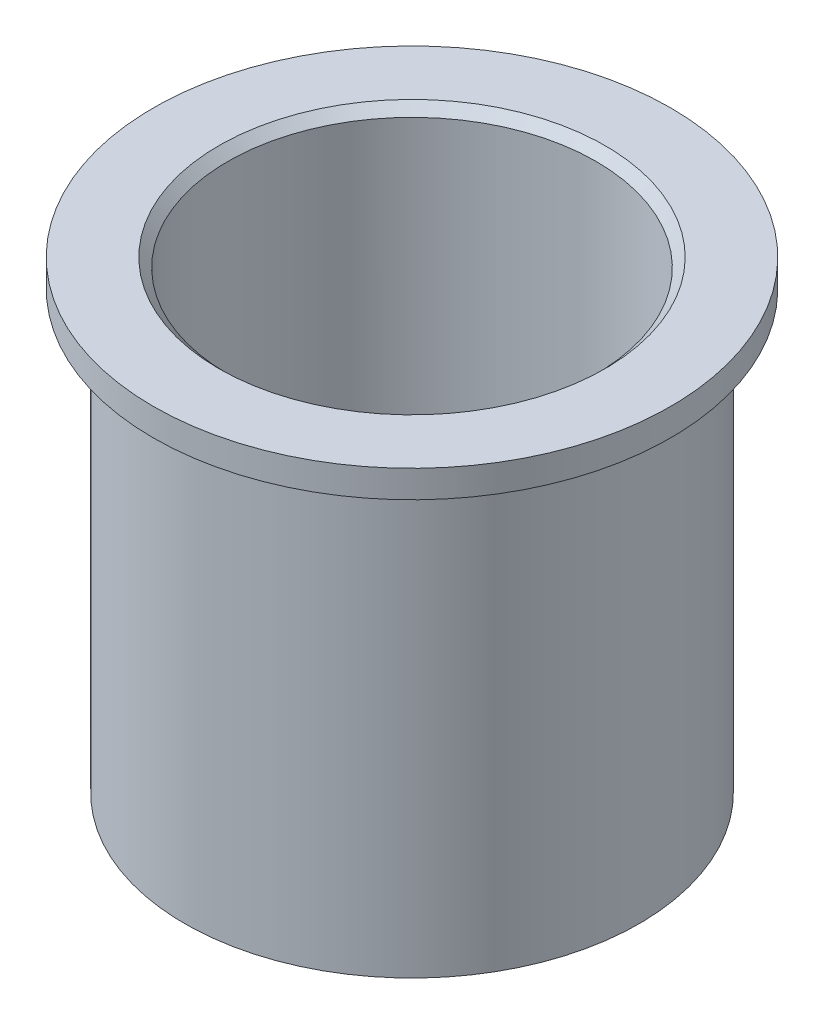
ISO-10303-21;
HEADER;
FILE_DESCRIPTION(('STEP AP214'),'2;1');
FILE_NAME('part.step','',(''),(''),'','','');
FILE_SCHEMA(('AUTOMOTIVE_DESIGN { 1 0 10303 214 1 1 1 1 }'));
ENDSEC;
DATA;
#1=APPLICATION_CONTEXT('core data for automotive mechanical design processes');
#2=APPLICATION_PROTOCOL_DEFINITION('international standard','automotive_design',2000,#1);
#3=PRODUCT_CONTEXT('',#1,'mechanical');
#4=PRODUCT('Part','Part','',(#3));
#5=PRODUCT_RELATED_PRODUCT_CATEGORY('part','',(#4));
#6=PRODUCT_DEFINITION_FORMATION('','',#4);
#7=PRODUCT_DEFINITION_CONTEXT('part definition',#1,'design');
#8=PRODUCT_DEFINITION('design','',#6,#7);
#9=PRODUCT_DEFINITION_SHAPE('','',#8);
#10=(LENGTH_UNIT() NAMED_UNIT(*) SI_UNIT(.MILLI.,.METRE.));
#11=(NAMED_UNIT(*) PLANE_ANGLE_UNIT() SI_UNIT($,.RADIAN.));
#12=(NAMED_UNIT(*) SI_UNIT($,.STERADIAN.) SOLID_ANGLE_UNIT());
#13=UNCERTAINTY_MEASURE_WITH_UNIT(LENGTH_MEASURE(1.E-05),#10,'distance_accuracy_value','');
#14=(GEOMETRIC_REPRESENTATION_CONTEXT(3) GLOBAL_UNCERTAINTY_ASSIGNED_CONTEXT((#13)) GLOBAL_UNIT_ASSIGNED_CONTEXT((#10,
#11,#12)) REPRESENTATION_CONTEXT('',''));
#15=CARTESIAN_POINT('',(0.,0.,0.));
#16=DIRECTION('',(0.,0.,1.));
#17=DIRECTION('',(1.,0.,0.));
#18=AXIS2_PLACEMENT_3D('',#15,#16,#17);
#19=CARTESIAN_POINT('',(0.,0.,0.));
#20=DIRECTION('',(0.,1.,0.));
#21=DIRECTION('',(0.,0.,1.));
#22=AXIS2_PLACEMENT_3D('',#19,#20,#21);
#23=PLANE('',#22);
#24=CARTESIAN_POINT('',(0.,0.,0.));
#25=DIRECTION('',(0.,1.,0.));
#26=DIRECTION('',(0.,0.,1.));
#27=AXIS2_PLACEMENT_3D('',#24,#25,#26);
#28=CIRCLE('',#27,10.795);
#29=CARTESIAN_POINT('',(0.,0.,10.795));
#30=VERTEX_POINT('',#29);
#31=EDGE_CURVE('E10',#30,#30,#28,.T.);
#32=ORIENTED_EDGE('',*,*,#31,.T.);
#33=EDGE_LOOP('',(#32));
#34=FACE_BOUND('',#33,.T.);
#35=CARTESIAN_POINT('',(0.,0.,0.));
#36=DIRECTION('',(0.,1.,0.));
#37=DIRECTION('',(0.,0.,1.));
#38=AXIS2_PLACEMENT_3D('',#35,#36,#37);
#39=CIRCLE('',#38,12.7);
#40=CARTESIAN_POINT('',(0.,0.,-12.7));
#41=VERTEX_POINT('',#40);
#42=EDGE_CURVE('E54',#41,#41,#39,.T.);
#43=ORIENTED_EDGE('',*,*,#42,.F.);
#44=EDGE_LOOP('',(#43));
#45=FACE_BOUND('',#44,.T.);
#46=ADVANCED_FACE('F33',(#34,#45),#23,.F.);
#47=CARTESIAN_POINT('',(0.,24.384,0.));
#48=DIRECTION('',(0.,-1.,0.));
#49=DIRECTION('',(0.,0.,-1.));
#50=AXIS2_PLACEMENT_3D('',#47,#48,#49);
#51=CYLINDRICAL_SURFACE('',#50,12.7);
#52=CARTESIAN_POINT('',(0.,24.384,0.));
#53=DIRECTION('',(0.,1.,0.));
#54=DIRECTION('',(0.,0.,1.));
#55=AXIS2_PLACEMENT_3D('',#52,#53,#54);
#56=CIRCLE('',#55,12.7);
#57=CARTESIAN_POINT('',(0.,24.384,-12.7));
#58=VERTEX_POINT('',#57);
#59=EDGE_CURVE('E53',#58,#58,#56,.T.);
#60=CARTESIAN_POINT('',(0.,24.384,-12.7));
#61=CARTESIAN_POINT('',(0.,24.13,-12.7));
#62=CARTESIAN_POINT('',(0.,23.876,-12.7));
#63=CARTESIAN_POINT('',(0.,23.368,-12.7));
#64=CARTESIAN_POINT('',(0.,23.114,-12.7));
#65=CARTESIAN_POINT('',(0.,22.606,-12.7));
#66=CARTESIAN_POINT('',(0.,22.352,-12.7));
#67=CARTESIAN_POINT('',(0.,21.844,-12.7));
#68=CARTESIAN_POINT('',(0.,21.59,-12.7));
#69=CARTESIAN_POINT('',(0.,21.082,-12.7));
#70=CARTESIAN_POINT('',(0.,20.828,-12.7));
#71=CARTESIAN_POINT('',(0.,20.32,-12.7));
#72=CARTESIAN_POINT('',(0.,20.066,-12.7));
#73=CARTESIAN_POINT('',(0.,19.558,-12.7));
#74=CARTESIAN_POINT('',(0.,19.304,-12.7));
#75=CARTESIAN_POINT('',(0.,18.796,-12.7));
#76=CARTESIAN_POINT('',(0.,18.542,-12.7));
#77=CARTESIAN_POINT('',(0.,18.034,-12.7));
#78=CARTESIAN_POINT('',(0.,17.78,-12.7));
#79=CARTESIAN_POINT('',(0.,17.272,-12.7));
#80=CARTESIAN_POINT('',(0.,17.018,-12.7));
#81=CARTESIAN_POINT('',(0.,16.51,-12.7));
#82=CARTESIAN_POINT('',(0.,16.256,-12.7));
#83=CARTESIAN_POINT('',(0.,15.748,-12.7));
#84=CARTESIAN_POINT('',(0.,15.494,-12.7));
#85=CARTESIAN_POINT('',(0.,14.986,-12.7));
#86=CARTESIAN_POINT('',(0.,14.732,-12.7));
#87=CARTESIAN_POINT('',(0.,14.224,-12.7));
#88=CARTESIAN_POINT('',(0.,13.97,-12.7));
#89=CARTESIAN_POINT('',(0.,13.462,-12.7));
#90=CARTESIAN_POINT('',(0.,13.208,-12.7));
#91=CARTESIAN_POINT('',(0.,12.7,-12.7));
#92=CARTESIAN_POINT('',(0.,12.446,-12.7));
#93=CARTESIAN_POINT('',(0.,11.938,-12.7));
#94=CARTESIAN_POINT('',(0.,11.684,-12.7));
#95=CARTESIAN_POINT('',(0.,11.176,-12.7));
#96=CARTESIAN_POINT('',(0.,10.922,-12.7));
#97=CARTESIAN_POINT('',(0.,10.414,-12.7));
#98=CARTESIAN_POINT('',(0.,10.16,-12.7));
#99=CARTESIAN_POINT('',(0.,9.652,-12.7));
#100=CARTESIAN_POINT('',(0.,9.398,-12.7));
#101=CARTESIAN_POINT('',(0.,8.89,-12.7));
#102=CARTESIAN_POINT('',(0.,8.636,-12.7));
#103=CARTESIAN_POINT('',(0.,8.128,-12.7));
#104=CARTESIAN_POINT('',(0.,7.874,-12.7));
#105=CARTESIAN_POINT('',(0.,7.366,-12.7));
#106=CARTESIAN_POINT('',(0.,7.112,-12.7));
#107=CARTESIAN_POINT('',(0.,6.604,-12.7));
#108=CARTESIAN_POINT('',(0.,6.35,-12.7));
#109=CARTESIAN_POINT('',(0.,5.842,-12.7));
#110=CARTESIAN_POINT('',(0.,5.588,-12.7));
#111=CARTESIAN_POINT('',(0.,5.08,-12.7));
#112=CARTESIAN_POINT('',(0.,4.826,-12.7));
#113=CARTESIAN_POINT('',(0.,4.318,-12.7));
#114=CARTESIAN_POINT('',(0.,4.064,-12.7));
#115=CARTESIAN_POINT('',(0.,3.556,-12.7));
#116=CARTESIAN_POINT('',(0.,3.302,-12.7));
#117=CARTESIAN_POINT('',(0.,2.794,-12.7));
#118=CARTESIAN_POINT('',(0.,2.54,-12.7));
#119=CARTESIAN_POINT('',(0.,2.032,-12.7));
#120=CARTESIAN_POINT('',(0.,1.778,-12.7));
#121=CARTESIAN_POINT('',(0.,1.27,-12.7));
#122=CARTESIAN_POINT('',(0.,1.016,-12.7));
#123=CARTESIAN_POINT('',(0.,0.507999999999999,-12.7));
#124=CARTESIAN_POINT('',(0.,0.254,-12.7));
#125=CARTESIAN_POINT('',(0.,0.,-12.7));
#126=B_SPLINE_CURVE_WITH_KNOTS('',3,(#60,#61,#62,#63,#64,#65,#66,#67,#68,#69,#70,#71,#72,#73,
#74,#75,#76,#77,#78,#79,#80,#81,#82,#83,#84,#85,#86,#87,#88,#89,#90,#91,#92,#93,#94,#95,#96,#97,
#98,#99,#100,#101,#102,#103,#104,#105,#106,#107,#108,#109,#110,#111,#112,#113,#114,#115,#116,
#117,#118,#119,#120,#121,#122,#123,#124,#125),.UNSPECIFIED.,.F.,.F.,(4,2,2,2,2,2,2,2,2,2,2,2,2,
2,2,2,2,2,2,2,2,2,2,2,2,2,2,2,2,2,2,2,4),(0.,0.761999999999999,1.524,2.286,3.048,3.81,4.572,
5.334,6.096,6.858,7.62,8.382,9.144,9.906,10.668,11.43,12.192,12.954,13.716,14.478,15.24,16.002,
16.764,17.526,18.288,19.05,19.812,20.574,21.336,22.098,22.86,23.622,24.384),.UNSPECIFIED.);
#127=EDGE_CURVE('BSEAM82',#58,#41,#126,.T.);
#128=ORIENTED_EDGE('',*,*,#59,.F.);
#129=ORIENTED_EDGE('',*,*,#42,.T.);
#130=ORIENTED_EDGE('',*,*,#127,.T.);
#131=ORIENTED_EDGE('',*,*,#127,.F.);
#132=EDGE_LOOP('',(#128,#130,#129,#131));
#133=FACE_BOUND('',#132,.T.);
#134=ADVANCED_FACE('F82',(#133),#51,.T.);
#135=CARTESIAN_POINT('',(0.,24.384,0.));
#136=DIRECTION('',(0.,-1.,0.));
#137=DIRECTION('',(0.,0.,-1.));
#138=AXIS2_PLACEMENT_3D('',#135,#136,#137);
#139=CYLINDRICAL_SURFACE('',#138,10.287);
#140=CARTESIAN_POINT('',(0.,25.4,0.));
#141=DIRECTION('',(0.,1.,0.));
#142=DIRECTION('',(0.,0.,1.));
#143=AXIS2_PLACEMENT_3D('',#140,#141,#142);
#144=CIRCLE('',#143,10.287);
#145=CARTESIAN_POINT('',(0.,25.4,-10.287));
#146=VERTEX_POINT('',#145);
#147=EDGE_CURVE('E44',#146,#146,#144,.T.);
#148=CARTESIAN_POINT('',(0.,0.507999999999988,0.));
#149=DIRECTION('',(0.,1.,0.));
#150=DIRECTION('',(0.,0.,1.));
#151=AXIS2_PLACEMENT_3D('',#148,#149,#150);
#152=CIRCLE('',#151,10.287);
#153=CARTESIAN_POINT('',(0.,0.507999999999988,-10.287));
#154=VERTEX_POINT('',#153);
#155=EDGE_CURVE('E48',#154,#154,#152,.F.);
#156=CARTESIAN_POINT('',(0.,25.4,-10.287));
#157=CARTESIAN_POINT('',(0.,25.1407083333333,-10.287));
#158=CARTESIAN_POINT('',(0.,24.8814166666667,-10.287));
#159=CARTESIAN_POINT('',(0.,24.3628333333333,-10.287));
#160=CARTESIAN_POINT('',(0.,24.1035416666667,-10.287));
#161=CARTESIAN_POINT('',(0.,23.5849583333333,-10.287));
#162=CARTESIAN_POINT('',(0.,23.3256666666667,-10.287));
#163=CARTESIAN_POINT('',(0.,22.8070833333333,-10.287));
#164=CARTESIAN_POINT('',(0.,22.5477916666667,-10.287));
#165=CARTESIAN_POINT('',(0.,22.0292083333333,-10.287));
#166=CARTESIAN_POINT('',(0.,21.7699166666667,-10.287));
#167=CARTESIAN_POINT('',(0.,21.2513333333333,-10.287));
#168=CARTESIAN_POINT('',(0.,20.9920416666667,-10.287));
#169=CARTESIAN_POINT('',(0.,20.4734583333333,-10.287));
#170=CARTESIAN_POINT('',(0.,20.2141666666667,-10.287));
#171=CARTESIAN_POINT('',(0.,19.6955833333333,-10.287));
#172=CARTESIAN_POINT('',(0.,19.4362916666667,-10.287));
#173=CARTESIAN_POINT('',(0.,18.9177083333333,-10.287));
#174=CARTESIAN_POINT('',(0.,18.6584166666667,-10.287));
#175=CARTESIAN_POINT('',(0.,18.1398333333333,-10.287));
#176=CARTESIAN_POINT('',(0.,17.8805416666667,-10.287));
#177=CARTESIAN_POINT('',(0.,17.3619583333333,-10.287));
#178=CARTESIAN_POINT('',(0.,17.1026666666667,-10.287));
#179=CARTESIAN_POINT('',(0.,16.5840833333333,-10.287));
#180=CARTESIAN_POINT('',(0.,16.3247916666667,-10.287));
#181=CARTESIAN_POINT('',(0.,15.8062083333333,-10.287));
#182=CARTESIAN_POINT('',(0.,15.5469166666667,-10.287));
#183=CARTESIAN_POINT('',(0.,15.0283333333333,-10.287));
#184=CARTESIAN_POINT('',(0.,14.7690416666667,-10.287));
#185=CARTESIAN_POINT('',(0.,14.2504583333333,-10.287));
#186=CARTESIAN_POINT('',(0.,13.9911666666667,-10.287));
#187=CARTESIAN_POINT('',(0.,13.4725833333333,-10.287));
#188=CARTESIAN_POINT('',(0.,13.2132916666667,-10.287));
#189=CARTESIAN_POINT('',(0.,12.6947083333333,-10.287));
#190=CARTESIAN_POINT('',(0.,12.4354166666667,-10.287));
#191=CARTESIAN_POINT('',(0.,11.9168333333333,-10.287));
#192=CARTESIAN_POINT('',(0.,11.6575416666667,-10.287));
#193=CARTESIAN_POINT('',(0.,11.1389583333333,-10.287));
#194=CARTESIAN_POINT('',(0.,10.8796666666667,-10.287));
#195=CARTESIAN_POINT('',(0.,10.3610833333333,-10.287));
#196=CARTESIAN_POINT('',(0.,10.1017916666667,-10.287));
#197=CARTESIAN_POINT('',(0.,9.58320833333332,-10.287));
#198=CARTESIAN_POINT('',(0.,9.32391666666665,-10.287));
#199=CARTESIAN_POINT('',(0.,8.80533333333332,-10.287));
#200=CARTESIAN_POINT('',(0.,8.54604166666665,-10.287));
#201=CARTESIAN_POINT('',(0.,8.02745833333332,-10.287));
#202=CARTESIAN_POINT('',(0.,7.76816666666666,-10.287));
#203=CARTESIAN_POINT('',(0.,7.24958333333332,-10.287));
#204=CARTESIAN_POINT('',(0.,6.99029166666666,-10.287));
#205=CARTESIAN_POINT('',(0.,6.47170833333332,-10.287));
#206=CARTESIAN_POINT('',(0.,6.21241666666666,-10.287));
#207=CARTESIAN_POINT('',(0.,5.69383333333332,-10.287));
#208=CARTESIAN_POINT('',(0.,5.43454166666666,-10.287));
#209=CARTESIAN_POINT('',(0.,4.91595833333332,-10.287));
#210=CARTESIAN_POINT('',(0.,4.65666666666666,-10.287));
#211=CARTESIAN_POINT('',(0.,4.13808333333332,-10.287));
#212=CARTESIAN_POINT('',(0.,3.87879166666666,-10.287));
#213=CARTESIAN_POINT('',(0.,3.36020833333332,-10.287));
#214=CARTESIAN_POINT('',(0.,3.10091666666665,-10.287));
#215=CARTESIAN_POINT('',(0.,2.58233333333332,-10.287));
#216=CARTESIAN_POINT('',(0.,2.32304166666666,-10.287));
#217=CARTESIAN_POINT('',(0.,1.80445833333332,-10.287));
#218=CARTESIAN_POINT('',(0.,1.54516666666666,-10.287));
#219=CARTESIAN_POINT('',(0.,1.02658333333332,-10.287));
#220=CARTESIAN_POINT('',(0.,0.767291666666656,-10.287));
#221=CARTESIAN_POINT('',(0.,0.507999999999988,-10.287));
#222=B_SPLINE_CURVE_WITH_KNOTS('',3,(#156,#157,#158,#159,#160,#161,#162,#163,#164,#165,#166,
#167,#168,#169,#170,#171,#172,#173,#174,#175,#176,#177,#178,#179,#180,#181,#182,#183,#184,#185,
#186,#187,#188,#189,#190,#191,#192,#193,#194,#195,#196,#197,#198,#199,#200,#201,#202,#203,#204,
#205,#206,#207,#208,#209,#210,#211,#212,#213,#214,#215,#216,#217,#218,#219,#220,#221),
.UNSPECIFIED.,.F.,.F.,(4,2,2,2,2,2,2,2,2,2,2,2,2,2,2,2,2,2,2,2,2,2,2,2,2,2,2,2,2,2,2,2,4),(0.,
0.777874999999997,1.55575,2.333625,3.1115,3.889375,4.66725,5.445125,6.223,7.000875,7.77875,
8.556625,9.3345,10.112375,10.89025,11.668125,12.446,13.223875,14.00175,14.779625,15.5575,
16.335375,17.11325,17.891125,18.669,19.446875,20.22475,21.002625,21.7805,22.558375,23.33625,
24.114125,24.892),.UNSPECIFIED.);
#223=EDGE_CURVE('BSEAM78',#146,#154,#222,.T.);
#224=ORIENTED_EDGE('',*,*,#147,.T.);
#225=ORIENTED_EDGE('',*,*,#155,.T.);
#226=ORIENTED_EDGE('',*,*,#223,.T.);
#227=ORIENTED_EDGE('',*,*,#223,.F.);
#228=EDGE_LOOP('',(#224,#226,#225,#227));
#229=FACE_BOUND('',#228,.T.);
#230=ADVANCED_FACE('F78',(#229),#139,.F.);
#231=CARTESIAN_POINT('',(0.,24.384,0.));
#232=DIRECTION('',(0.,1.,0.));
#233=DIRECTION('',(0.,0.,1.));
#234=AXIS2_PLACEMENT_3D('',#231,#232,#233);
#235=PLANE('',#234);
#236=CARTESIAN_POINT('',(0.,24.384,0.));
#237=DIRECTION('',(0.,1.,0.));
#238=DIRECTION('',(0.,0.,1.));
#239=AXIS2_PLACEMENT_3D('',#236,#237,#238);
#240=CIRCLE('',#239,14.4526);
#241=CARTESIAN_POINT('',(0.,24.384,-14.4526));
#242=VERTEX_POINT('',#241);
#243=EDGE_CURVE('E60',#242,#242,#240,.T.);
#244=ORIENTED_EDGE('',*,*,#243,.F.);
#245=EDGE_LOOP('',(#244));
#246=FACE_BOUND('',#245,.T.);
#247=ORIENTED_EDGE('',*,*,#59,.T.);
#248=EDGE_LOOP('',(#247));
#249=FACE_BOUND('',#248,.T.);
#250=ADVANCED_FACE('F75',(#246,#249),#235,.F.);
#251=CARTESIAN_POINT('',(0.,25.908,0.));
#252=DIRECTION('',(0.,1.,0.));
#253=DIRECTION('',(0.,0.,1.));
#254=AXIS2_PLACEMENT_3D('',#251,#252,#253);
#255=PLANE('',#254);
#256=CARTESIAN_POINT('',(0.,25.908,0.));
#257=DIRECTION('',(0.,1.,0.));
#258=DIRECTION('',(0.,0.,1.));
#259=AXIS2_PLACEMENT_3D('',#256,#257,#258);
#260=CIRCLE('',#259,10.795);
#261=CARTESIAN_POINT('',(0.,25.908,10.795));
#262=VERTEX_POINT('',#261);
#263=EDGE_CURVE('E40',#262,#262,#260,.F.);
#264=ORIENTED_EDGE('',*,*,#263,.T.);
#265=EDGE_LOOP('',(#264));
#266=FACE_BOUND('',#265,.T.);
#267=CARTESIAN_POINT('',(0.,25.908,0.));
#268=DIRECTION('',(0.,1.,0.));
#269=DIRECTION('',(0.,0.,1.));
#270=AXIS2_PLACEMENT_3D('',#267,#268,#269);
#271=CIRCLE('',#270,14.4526);
#272=CARTESIAN_POINT('',(0.,25.908,-14.4526));
#273=VERTEX_POINT('',#272);
#274=EDGE_CURVE('E57',#273,#273,#271,.T.);
#275=ORIENTED_EDGE('',*,*,#274,.T.);
#276=EDGE_LOOP('',(#275));
#277=FACE_BOUND('',#276,.T.);
#278=ADVANCED_FACE('F66',(#266,#277),#255,.T.);
#279=CARTESIAN_POINT('',(0.,25.908,0.));
#280=DIRECTION('',(0.,-1.,0.));
#281=DIRECTION('',(0.,0.,-1.));
#282=AXIS2_PLACEMENT_3D('',#279,#280,#281);
#283=CYLINDRICAL_SURFACE('',#282,14.4526);
#284=CARTESIAN_POINT('',(0.,25.908,-14.4526));
#285=CARTESIAN_POINT('',(0.,25.892125,-14.4526));
#286=CARTESIAN_POINT('',(0.,25.87625,-14.4526));
#287=CARTESIAN_POINT('',(0.,25.8445,-14.4526));
#288=CARTESIAN_POINT('',(0.,25.828625,-14.4526));
#289=CARTESIAN_POINT('',(0.,25.796875,-14.4526));
#290=CARTESIAN_POINT('',(0.,25.781,-14.4526));
#291=CARTESIAN_POINT('',(0.,25.74925,-14.4526));
#292=CARTESIAN_POINT('',(0.,25.733375,-14.4526));
#293=CARTESIAN_POINT('',(0.,25.701625,-14.4526));
#294=CARTESIAN_POINT('',(0.,25.68575,-14.4526));
#295=CARTESIAN_POINT('',(0.,25.654,-14.4526));
#296=CARTESIAN_POINT('',(0.,25.638125,-14.4526));
#297=CARTESIAN_POINT('',(0.,25.606375,-14.4526));
#298=CARTESIAN_POINT('',(0.,25.5905,-14.4526));
#299=CARTESIAN_POINT('',(0.,25.55875,-14.4526));
#300=CARTESIAN_POINT('',(0.,25.542875,-14.4526));
#301=CARTESIAN_POINT('',(0.,25.511125,-14.4526));
#302=CARTESIAN_POINT('',(0.,25.49525,-14.4526));
#303=CARTESIAN_POINT('',(0.,25.4635,-14.4526));
#304=CARTESIAN_POINT('',(0.,25.447625,-14.4526));
#305=CARTESIAN_POINT('',(0.,25.415875,-14.4526));
#306=CARTESIAN_POINT('',(0.,25.4,-14.4526));
#307=CARTESIAN_POINT('',(0.,25.36825,-14.4526));
#308=CARTESIAN_POINT('',(0.,25.352375,-14.4526));
#309=CARTESIAN_POINT('',(0.,25.320625,-14.4526));
#310=CARTESIAN_POINT('',(0.,25.30475,-14.4526));
#311=CARTESIAN_POINT('',(0.,25.273,-14.4526));
#312=CARTESIAN_POINT('',(0.,25.257125,-14.4526));
#313=CARTESIAN_POINT('',(0.,25.225375,-14.4526));
#314=CARTESIAN_POINT('',(0.,25.2095,-14.4526));
#315=CARTESIAN_POINT('',(0.,25.17775,-14.4526));
#316=CARTESIAN_POINT('',(0.,25.161875,-14.4526));
#317=CARTESIAN_POINT('',(0.,25.130125,-14.4526));
#318=CARTESIAN_POINT('',(0.,25.11425,-14.4526));
#319=CARTESIAN_POINT('',(0.,25.0825,-14.4526));
#320=CARTESIAN_POINT('',(0.,25.066625,-14.4526));
#321=CARTESIAN_POINT('',(0.,25.034875,-14.4526));
#322=CARTESIAN_POINT('',(0.,25.019,-14.4526));
#323=CARTESIAN_POINT('',(0.,24.98725,-14.4526));
#324=CARTESIAN_POINT('',(0.,24.971375,-14.4526));
#325=CARTESIAN_POINT('',(0.,24.939625,-14.4526));
#326=CARTESIAN_POINT('',(0.,24.92375,-14.4526));
#327=CARTESIAN_POINT('',(0.,24.892,-14.4526));
#328=CARTESIAN_POINT('',(0.,24.876125,-14.4526));
#329=CARTESIAN_POINT('',(0.,24.844375,-14.4526));
#330=CARTESIAN_POINT('',(0.,24.8285,-14.4526));
#331=CARTESIAN_POINT('',(0.,24.79675,-14.4526));
#332=CARTESIAN_POINT('',(0.,24.780875,-14.4526));
#333=CARTESIAN_POINT('',(0.,24.749125,-14.4526));
#334=CARTESIAN_POINT('',(0.,24.73325,-14.4526));
#335=CARTESIAN_POINT('',(0.,24.7015,-14.4526));
#336=CARTESIAN_POINT('',(0.,24.685625,-14.4526));
#337=CARTESIAN_POINT('',(0.,24.653875,-14.4526));
#338=CARTESIAN_POINT('',(0.,24.638,-14.4526));
#339=CARTESIAN_POINT('',(0.,24.60625,-14.4526));
#340=CARTESIAN_POINT('',(0.,24.590375,-14.4526));
#341=CARTESIAN_POINT('',(0.,24.558625,-14.4526));
#342=CARTESIAN_POINT('',(0.,24.54275,-14.4526));
#343=CARTESIAN_POINT('',(0.,24.511,-14.4526));
#344=CARTESIAN_POINT('',(0.,24.495125,-14.4526));
#345=CARTESIAN_POINT('',(0.,24.463375,-14.4526));
#346=CARTESIAN_POINT('',(0.,24.4475,-14.4526));
#347=CARTESIAN_POINT('',(0.,24.41575,-14.4526));
#348=CARTESIAN_POINT('',(0.,24.399875,-14.4526));
#349=CARTESIAN_POINT('',(0.,24.384,-14.4526));
#350=B_SPLINE_CURVE_WITH_KNOTS('',3,(#284,#285,#286,#287,#288,#289,#290,#291,#292,#293,#294,
#295,#296,#297,#298,#299,#300,#301,#302,#303,#304,#305,#306,#307,#308,#309,#310,#311,#312,#313,
#314,#315,#316,#317,#318,#319,#320,#321,#322,#323,#324,#325,#326,#327,#328,#329,#330,#331,#332,
#333,#334,#335,#336,#337,#338,#339,#340,#341,#342,#343,#344,#345,#346,#347,#348,#349),
.UNSPECIFIED.,.F.,.F.,(4,2,2,2,2,2,2,2,2,2,2,2,2,2,2,2,2,2,2,2,2,2,2,2,2,2,2,2,2,2,2,2,4),(0.,
0.0476249999999991,0.0952499999999981,0.142874999999997,0.1905,0.238124999999999,
0.285749999999998,0.333374999999997,0.380999999999999,0.428624999999998,0.476249999999998,
0.523875,0.571499999999999,0.619124999999998,0.666749999999997,0.714375,0.761999999999999,
0.809624999999998,0.85725,0.904874999999999,0.952499999999998,1.000125,1.04775,1.095375,1.143,
1.190625,1.23825,1.285875,1.3335,1.381125,1.42875,1.476375,1.524),.UNSPECIFIED.);
#351=EDGE_CURVE('BSEAM68',#273,#242,#350,.T.);
#352=ORIENTED_EDGE('',*,*,#274,.F.);
#353=ORIENTED_EDGE('',*,*,#243,.T.);
#354=ORIENTED_EDGE('',*,*,#351,.T.);
#355=ORIENTED_EDGE('',*,*,#351,.F.);
#356=EDGE_LOOP('',(#352,#354,#353,#355));
#357=FACE_BOUND('',#356,.T.);
#358=ADVANCED_FACE('F68',(#357),#283,.T.);
#359=CARTESIAN_POINT('',(0.,25.4,0.));
#360=DIRECTION('',(0.,1.,0.));
#361=DIRECTION('',(0.,0.,1.));
#362=AXIS2_PLACEMENT_3D('',#359,#360,#361);
#363=CONICAL_SURFACE('',#362,10.287,0.78539816339745);
#364=ORIENTED_EDGE('',*,*,#263,.F.);
#365=EDGE_LOOP('',(#364));
#366=FACE_BOUND('',#365,.T.);
#367=ORIENTED_EDGE('',*,*,#147,.F.);
#368=EDGE_LOOP('',(#367));
#369=FACE_BOUND('',#368,.T.);
#370=ADVANCED_FACE('F71',(#366,#369),#363,.F.);
#371=CARTESIAN_POINT('',(0.,0.,0.));
#372=DIRECTION('',(0.,-1.,0.));
#373=DIRECTION('',(0.,0.,-1.));
#374=AXIS2_PLACEMENT_3D('',#371,#372,#373);
#375=CONICAL_SURFACE('',#374,10.795,0.78539816339745);
#376=ORIENTED_EDGE('',*,*,#155,.F.);
#377=EDGE_LOOP('',(#376));
#378=FACE_BOUND('',#377,.T.);
#379=ORIENTED_EDGE('',*,*,#31,.F.);
#380=EDGE_LOOP('',(#379));
#381=FACE_BOUND('',#380,.T.);
#382=ADVANCED_FACE('F35',(#378,#381),#375,.F.);
#383=CLOSED_SHELL('',(#46,#134,#230,#250,#278,#358,#370,#382));
#384=MANIFOLD_SOLID_BREP('B2',#383);
#385=ADVANCED_BREP_SHAPE_REPRESENTATION('',(#18,#384),#14);
#386=SHAPE_DEFINITION_REPRESENTATION(#9,#385);
ENDSEC;
END-ISO-10303-21;
